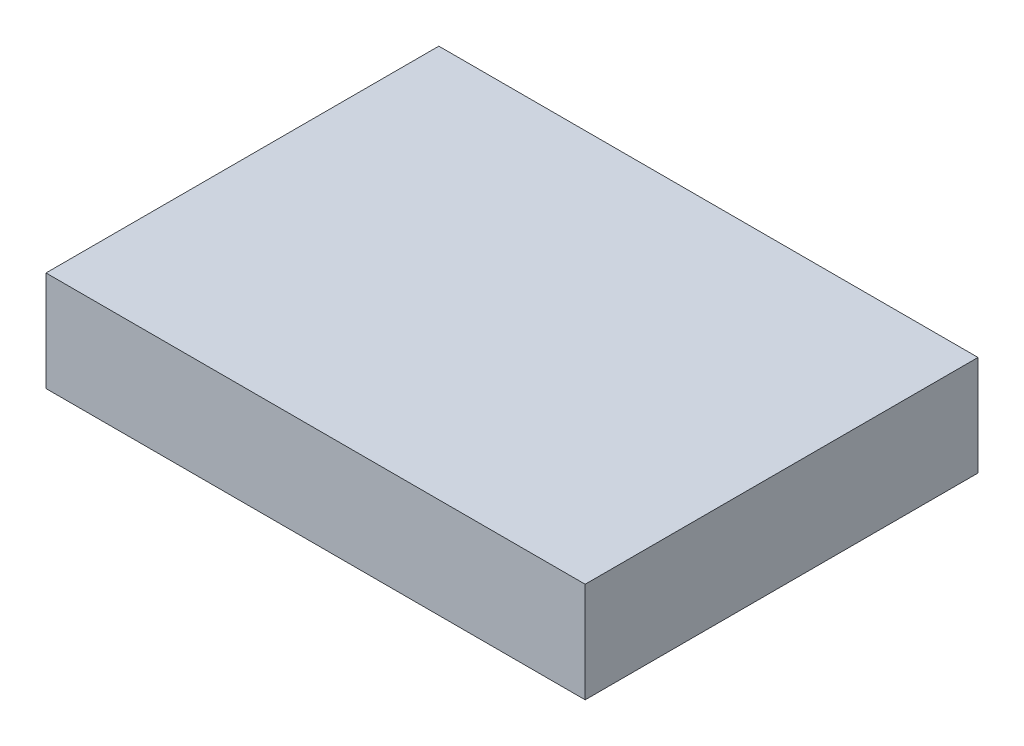
ISO-10303-21;
HEADER;
FILE_DESCRIPTION(('STEP AP214'),'2;1');
FILE_NAME('part.step','',(''),(''),'','','');
FILE_SCHEMA(('AUTOMOTIVE_DESIGN { 1 0 10303 214 1 1 1 1 }'));
ENDSEC;
DATA;
#1=APPLICATION_CONTEXT('core data for automotive mechanical design processes');
#2=APPLICATION_PROTOCOL_DEFINITION('international standard','automotive_design',2000,#1);
#3=PRODUCT_CONTEXT('',#1,'mechanical');
#4=PRODUCT('Part','Part','',(#3));
#5=PRODUCT_RELATED_PRODUCT_CATEGORY('part','',(#4));
#6=PRODUCT_DEFINITION_FORMATION('','',#4);
#7=PRODUCT_DEFINITION_CONTEXT('part definition',#1,'design');
#8=PRODUCT_DEFINITION('design','',#6,#7);
#9=PRODUCT_DEFINITION_SHAPE('','',#8);
#10=(LENGTH_UNIT() NAMED_UNIT(*) SI_UNIT(.MILLI.,.METRE.));
#11=(NAMED_UNIT(*) PLANE_ANGLE_UNIT() SI_UNIT($,.RADIAN.));
#12=(NAMED_UNIT(*) SI_UNIT($,.STERADIAN.) SOLID_ANGLE_UNIT());
#13=UNCERTAINTY_MEASURE_WITH_UNIT(LENGTH_MEASURE(1.E-05),#10,'distance_accuracy_value','');
#14=(GEOMETRIC_REPRESENTATION_CONTEXT(3) GLOBAL_UNCERTAINTY_ASSIGNED_CONTEXT((#13)) GLOBAL_UNIT_ASSIGNED_CONTEXT((#10,
#11,#12)) REPRESENTATION_CONTEXT('',''));
#15=CARTESIAN_POINT('',(0.,0.,0.));
#16=DIRECTION('',(0.,0.,1.));
#17=DIRECTION('',(1.,0.,0.));
#18=AXIS2_PLACEMENT_3D('',#15,#16,#17);
#19=CARTESIAN_POINT('',(0.,6.5,0.));
#20=DIRECTION('',(1.,0.,0.));
#21=DIRECTION('',(0.,0.,-1.));
#22=AXIS2_PLACEMENT_3D('',#19,#20,#21);
#23=PLANE('',#22);
#24=DIRECTION('',(0.,0.,1.));
#25=VECTOR('',#24,1.);
#26=CARTESIAN_POINT('',(0.,0.,0.));
#27=LINE('',#26,#25);
#28=CARTESIAN_POINT('',(0.,0.,-25.5));
#29=VERTEX_POINT('',#28);
#30=CARTESIAN_POINT('',(0.,0.,0.));
#31=VERTEX_POINT('',#30);
#32=EDGE_CURVE('E96',#29,#31,#27,.T.);
#33=ORIENTED_EDGE('',*,*,#32,.T.);
#34=DIRECTION('',(0.,-1.,0.));
#35=VECTOR('',#34,1.);
#36=CARTESIAN_POINT('',(0.,6.5,0.));
#37=LINE('',#36,#35);
#38=CARTESIAN_POINT('',(0.,6.5,0.));
#39=VERTEX_POINT('',#38);
#40=EDGE_CURVE('E11',#39,#31,#37,.T.);
#41=ORIENTED_EDGE('',*,*,#40,.F.);
#42=DIRECTION('',(0.,0.,1.));
#43=VECTOR('',#42,1.);
#44=CARTESIAN_POINT('',(0.,6.5,0.));
#45=LINE('',#44,#43);
#46=CARTESIAN_POINT('',(0.,6.5,-25.5));
#47=VERTEX_POINT('',#46);
#48=EDGE_CURVE('E84',#47,#39,#45,.T.);
#49=ORIENTED_EDGE('',*,*,#48,.F.);
#50=DIRECTION('',(0.,-1.,0.));
#51=VECTOR('',#50,1.);
#52=CARTESIAN_POINT('',(0.,6.5,-25.5));
#53=LINE('',#52,#51);
#54=EDGE_CURVE('E92',#47,#29,#53,.T.);
#55=ORIENTED_EDGE('',*,*,#54,.T.);
#56=EDGE_LOOP('',(#33,#41,#49,#55));
#57=FACE_BOUND('',#56,.T.);
#58=ADVANCED_FACE('F33',(#57),#23,.F.);
#59=CARTESIAN_POINT('',(0.,6.5,0.));
#60=DIRECTION('',(0.,0.,-1.));
#61=DIRECTION('',(-1.,0.,0.));
#62=AXIS2_PLACEMENT_3D('',#59,#60,#61);
#63=PLANE('',#62);
#64=DIRECTION('',(1.,0.,0.));
#65=VECTOR('',#64,1.);
#66=CARTESIAN_POINT('',(0.,0.,0.));
#67=LINE('',#66,#65);
#68=CARTESIAN_POINT('',(35.,0.,0.));
#69=VERTEX_POINT('',#68);
#70=EDGE_CURVE('E88',#31,#69,#67,.T.);
#71=ORIENTED_EDGE('',*,*,#70,.T.);
#72=DIRECTION('',(0.,-1.,0.));
#73=VECTOR('',#72,1.);
#74=CARTESIAN_POINT('',(35.,6.5,0.));
#75=LINE('',#74,#73);
#76=CARTESIAN_POINT('',(35.,6.5,0.));
#77=VERTEX_POINT('',#76);
#78=EDGE_CURVE('E41',#77,#69,#75,.T.);
#79=ORIENTED_EDGE('',*,*,#78,.F.);
#80=DIRECTION('',(1.,0.,0.));
#81=VECTOR('',#80,1.);
#82=CARTESIAN_POINT('',(0.,6.5,0.));
#83=LINE('',#82,#81);
#84=EDGE_CURVE('E79',#39,#77,#83,.T.);
#85=ORIENTED_EDGE('',*,*,#84,.F.);
#86=ORIENTED_EDGE('',*,*,#40,.T.);
#87=EDGE_LOOP('',(#71,#79,#85,#86));
#88=FACE_BOUND('',#87,.T.);
#89=ADVANCED_FACE('F87',(#88),#63,.F.);
#90=CARTESIAN_POINT('',(35.,6.5,0.));
#91=DIRECTION('',(-1.,0.,0.));
#92=DIRECTION('',(0.,0.,1.));
#93=AXIS2_PLACEMENT_3D('',#90,#91,#92);
#94=PLANE('',#93);
#95=DIRECTION('',(0.,0.,-1.));
#96=VECTOR('',#95,1.);
#97=CARTESIAN_POINT('',(35.,0.,0.));
#98=LINE('',#97,#96);
#99=CARTESIAN_POINT('',(35.,0.,-25.5));
#100=VERTEX_POINT('',#99);
#101=EDGE_CURVE('E66',#69,#100,#98,.T.);
#102=ORIENTED_EDGE('',*,*,#101,.T.);
#103=DIRECTION('',(0.,-1.,0.));
#104=VECTOR('',#103,1.);
#105=CARTESIAN_POINT('',(35.,6.5,-25.5));
#106=LINE('',#105,#104);
#107=CARTESIAN_POINT('',(35.,6.5,-25.5));
#108=VERTEX_POINT('',#107);
#109=EDGE_CURVE('E89',#108,#100,#106,.T.);
#110=ORIENTED_EDGE('',*,*,#109,.F.);
#111=DIRECTION('',(0.,0.,-1.));
#112=VECTOR('',#111,1.);
#113=CARTESIAN_POINT('',(35.,6.5,0.));
#114=LINE('',#113,#112);
#115=EDGE_CURVE('E82',#77,#108,#114,.T.);
#116=ORIENTED_EDGE('',*,*,#115,.F.);
#117=ORIENTED_EDGE('',*,*,#78,.T.);
#118=EDGE_LOOP('',(#102,#110,#116,#117));
#119=FACE_BOUND('',#118,.T.);
#120=ADVANCED_FACE('F90',(#119),#94,.F.);
#121=CARTESIAN_POINT('',(0.,6.5,-25.5));
#122=DIRECTION('',(0.,0.,1.));
#123=DIRECTION('',(1.,0.,0.));
#124=AXIS2_PLACEMENT_3D('',#121,#122,#123);
#125=PLANE('',#124);
#126=DIRECTION('',(-1.,0.,0.));
#127=VECTOR('',#126,1.);
#128=CARTESIAN_POINT('',(0.,0.,-25.5));
#129=LINE('',#128,#127);
#130=EDGE_CURVE('E72',#100,#29,#129,.T.);
#131=ORIENTED_EDGE('',*,*,#130,.T.);
#132=ORIENTED_EDGE('',*,*,#54,.F.);
#133=DIRECTION('',(-1.,0.,0.));
#134=VECTOR('',#133,1.);
#135=CARTESIAN_POINT('',(0.,6.5,-25.5));
#136=LINE('',#135,#134);
#137=EDGE_CURVE('E49',#108,#47,#136,.T.);
#138=ORIENTED_EDGE('',*,*,#137,.F.);
#139=ORIENTED_EDGE('',*,*,#109,.T.);
#140=EDGE_LOOP('',(#131,#132,#138,#139));
#141=FACE_BOUND('',#140,.T.);
#142=ADVANCED_FACE('F103',(#141),#125,.F.);
#143=CARTESIAN_POINT('',(0.,6.5,0.));
#144=DIRECTION('',(0.,-1.,0.));
#145=DIRECTION('',(0.,0.,-1.));
#146=AXIS2_PLACEMENT_3D('',#143,#144,#145);
#147=PLANE('',#146);
#148=ORIENTED_EDGE('',*,*,#48,.T.);
#149=ORIENTED_EDGE('',*,*,#84,.T.);
#150=ORIENTED_EDGE('',*,*,#115,.T.);
#151=ORIENTED_EDGE('',*,*,#137,.T.);
#152=EDGE_LOOP('',(#148,#149,#150,#151));
#153=FACE_BOUND('',#152,.T.);
#154=ADVANCED_FACE('F80',(#153),#147,.F.);
#155=CARTESIAN_POINT('',(0.,0.,0.));
#156=DIRECTION('',(0.,-1.,0.));
#157=DIRECTION('',(0.,0.,-1.));
#158=AXIS2_PLACEMENT_3D('',#155,#156,#157);
#159=PLANE('',#158);
#160=ORIENTED_EDGE('',*,*,#32,.F.);
#161=ORIENTED_EDGE('',*,*,#130,.F.);
#162=ORIENTED_EDGE('',*,*,#101,.F.);
#163=ORIENTED_EDGE('',*,*,#70,.F.);
#164=EDGE_LOOP('',(#160,#161,#162,#163));
#165=FACE_BOUND('',#164,.T.);
#166=ADVANCED_FACE('F106',(#165),#159,.T.);
#167=CLOSED_SHELL('',(#58,#89,#120,#142,#154,#166));
#168=MANIFOLD_SOLID_BREP('B2',#167);
#169=ADVANCED_BREP_SHAPE_REPRESENTATION('',(#18,#168),#14);
#170=SHAPE_DEFINITION_REPRESENTATION(#9,#169);
ENDSEC;
END-ISO-10303-21;
